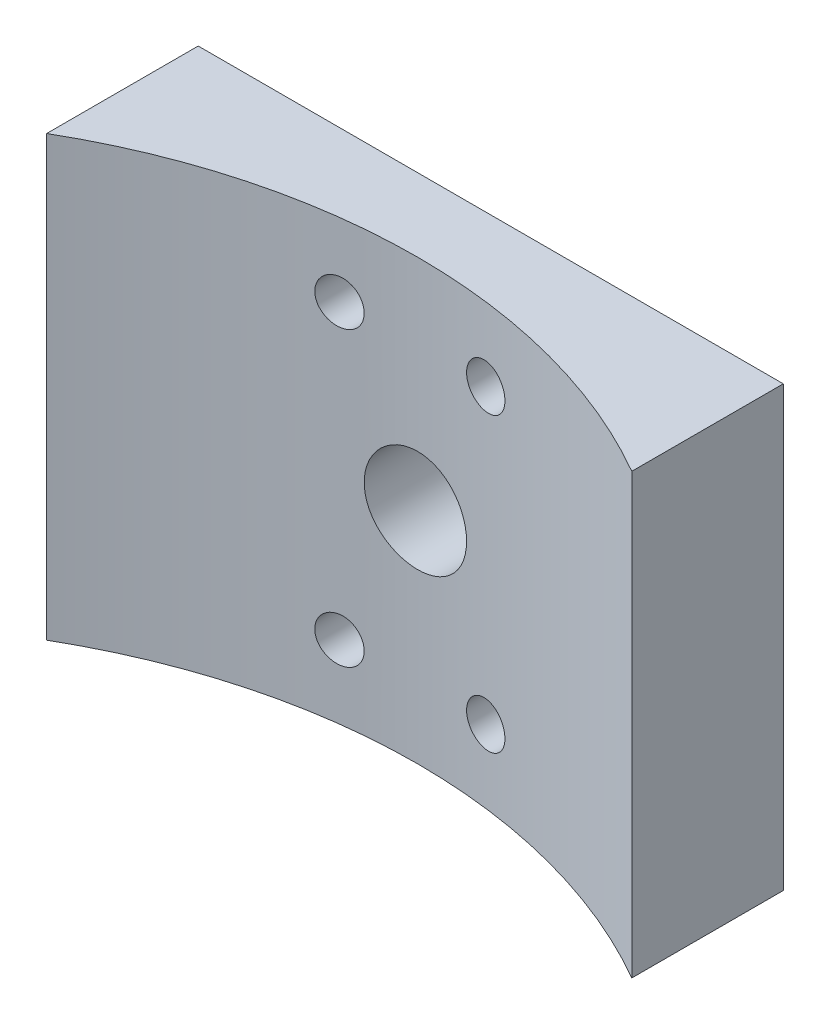
ISO-10303-21;
HEADER;
FILE_DESCRIPTION(('STEP AP214'),'2;1');
FILE_NAME('part.step','',(''),(''),'','','');
FILE_SCHEMA(('AUTOMOTIVE_DESIGN { 1 0 10303 214 1 1 1 1 }'));
ENDSEC;
DATA;
#1=APPLICATION_CONTEXT('core data for automotive mechanical design processes');
#2=APPLICATION_PROTOCOL_DEFINITION('international standard','automotive_design',2000,#1);
#3=PRODUCT_CONTEXT('',#1,'mechanical');
#4=PRODUCT('Part','Part','',(#3));
#5=PRODUCT_RELATED_PRODUCT_CATEGORY('part','',(#4));
#6=PRODUCT_DEFINITION_FORMATION('','',#4);
#7=PRODUCT_DEFINITION_CONTEXT('part definition',#1,'design');
#8=PRODUCT_DEFINITION('design','',#6,#7);
#9=PRODUCT_DEFINITION_SHAPE('','',#8);
#10=(LENGTH_UNIT() NAMED_UNIT(*) SI_UNIT(.MILLI.,.METRE.));
#11=(NAMED_UNIT(*) PLANE_ANGLE_UNIT() SI_UNIT($,.RADIAN.));
#12=(NAMED_UNIT(*) SI_UNIT($,.STERADIAN.) SOLID_ANGLE_UNIT());
#13=UNCERTAINTY_MEASURE_WITH_UNIT(LENGTH_MEASURE(1.E-05),#10,'distance_accuracy_value','');
#14=(GEOMETRIC_REPRESENTATION_CONTEXT(3) GLOBAL_UNCERTAINTY_ASSIGNED_CONTEXT((#13)) GLOBAL_UNIT_ASSIGNED_CONTEXT((#10,
#11,#12)) REPRESENTATION_CONTEXT('',''));
#15=CARTESIAN_POINT('',(0.,0.,0.));
#16=DIRECTION('',(0.,0.,1.));
#17=DIRECTION('',(1.,0.,0.));
#18=AXIS2_PLACEMENT_3D('',#15,#16,#17);
#19=CARTESIAN_POINT('',(20.,30.,-45.));
#20=DIRECTION('',(0.,0.,1.));
#21=DIRECTION('',(1.,0.,0.));
#22=AXIS2_PLACEMENT_3D('',#19,#20,#21);
#23=PLANE('',#22);
#24=CARTESIAN_POINT('',(-5.,25.,-45.));
#25=DIRECTION('',(0.,0.,1.));
#26=DIRECTION('',(1.,0.,0.));
#27=AXIS2_PLACEMENT_3D('',#24,#25,#26);
#28=CIRCLE('',#27,1.5);
#29=CARTESIAN_POINT('',(-3.5,25.,-45.));
#30=VERTEX_POINT('',#29);
#31=EDGE_CURVE('E163',#30,#30,#28,.T.);
#32=ORIENTED_EDGE('',*,*,#31,.T.);
#33=EDGE_LOOP('',(#32));
#34=FACE_BOUND('',#33,.T.);
#35=CARTESIAN_POINT('',(5.,25.,-45.));
#36=DIRECTION('',(0.,0.,1.));
#37=DIRECTION('',(1.,0.,0.));
#38=AXIS2_PLACEMENT_3D('',#35,#36,#37);
#39=CIRCLE('',#38,1.5);
#40=CARTESIAN_POINT('',(6.5,25.,-45.));
#41=VERTEX_POINT('',#40);
#42=EDGE_CURVE('E167',#41,#41,#39,.T.);
#43=ORIENTED_EDGE('',*,*,#42,.T.);
#44=EDGE_LOOP('',(#43));
#45=FACE_BOUND('',#44,.T.);
#46=CARTESIAN_POINT('',(0.,15.,-45.));
#47=DIRECTION('',(0.,0.,1.));
#48=DIRECTION('',(1.,0.,0.));
#49=AXIS2_PLACEMENT_3D('',#46,#47,#48);
#50=CIRCLE('',#49,3.5);
#51=CARTESIAN_POINT('',(3.5,15.,-45.));
#52=VERTEX_POINT('',#51);
#53=EDGE_CURVE('E171',#52,#52,#50,.T.);
#54=ORIENTED_EDGE('',*,*,#53,.T.);
#55=EDGE_LOOP('',(#54));
#56=FACE_BOUND('',#55,.T.);
#57=CARTESIAN_POINT('',(5.,5.,-45.));
#58=DIRECTION('',(0.,0.,1.));
#59=DIRECTION('',(1.,0.,0.));
#60=AXIS2_PLACEMENT_3D('',#57,#58,#59);
#61=CIRCLE('',#60,1.5);
#62=CARTESIAN_POINT('',(6.5,5.,-45.));
#63=VERTEX_POINT('',#62);
#64=EDGE_CURVE('E175',#63,#63,#61,.T.);
#65=ORIENTED_EDGE('',*,*,#64,.T.);
#66=EDGE_LOOP('',(#65));
#67=FACE_BOUND('',#66,.T.);
#68=CARTESIAN_POINT('',(-5.,5.,-45.));
#69=DIRECTION('',(0.,0.,1.));
#70=DIRECTION('',(1.,0.,0.));
#71=AXIS2_PLACEMENT_3D('',#68,#69,#70);
#72=CIRCLE('',#71,1.5);
#73=CARTESIAN_POINT('',(-3.5,5.,-45.));
#74=VERTEX_POINT('',#73);
#75=EDGE_CURVE('E126',#74,#74,#72,.T.);
#76=ORIENTED_EDGE('',*,*,#75,.T.);
#77=EDGE_LOOP('',(#76));
#78=FACE_BOUND('',#77,.T.);
#79=DIRECTION('',(-1.,0.,0.));
#80=VECTOR('',#79,1.);
#81=CARTESIAN_POINT('',(20.,0.,-45.));
#82=LINE('',#81,#80);
#83=CARTESIAN_POINT('',(20.,0.,-45.));
#84=VERTEX_POINT('',#83);
#85=CARTESIAN_POINT('',(-20.,0.,-45.));
#86=VERTEX_POINT('',#85);
#87=EDGE_CURVE('E100',#84,#86,#82,.T.);
#88=ORIENTED_EDGE('',*,*,#87,.T.);
#89=DIRECTION('',(0.,-1.,0.));
#90=VECTOR('',#89,1.);
#91=CARTESIAN_POINT('',(-20.,30.,-45.));
#92=LINE('',#91,#90);
#93=CARTESIAN_POINT('',(-20.,30.,-45.));
#94=VERTEX_POINT('',#93);
#95=EDGE_CURVE('E53',#94,#86,#92,.T.);
#96=ORIENTED_EDGE('',*,*,#95,.F.);
#97=DIRECTION('',(-1.,0.,0.));
#98=VECTOR('',#97,1.);
#99=CARTESIAN_POINT('',(20.,30.,-45.));
#100=LINE('',#99,#98);
#101=CARTESIAN_POINT('',(20.,30.,-45.));
#102=VERTEX_POINT('',#101);
#103=EDGE_CURVE('E93',#102,#94,#100,.T.);
#104=ORIENTED_EDGE('',*,*,#103,.F.);
#105=DIRECTION('',(0.,-1.,0.));
#106=VECTOR('',#105,1.);
#107=CARTESIAN_POINT('',(20.,30.,-45.));
#108=LINE('',#107,#106);
#109=EDGE_CURVE('E11',#102,#84,#108,.T.);
#110=ORIENTED_EDGE('',*,*,#109,.T.);
#111=EDGE_LOOP('',(#88,#96,#104,#110));
#112=FACE_BOUND('',#111,.T.);
#113=ADVANCED_FACE('F39',(#34,#45,#56,#67,#78,#112),#23,.F.);
#114=CARTESIAN_POINT('',(-20.,30.,-34.6410161513775));
#115=DIRECTION('',(1.,0.,0.));
#116=DIRECTION('',(0.,0.,-1.));
#117=AXIS2_PLACEMENT_3D('',#114,#115,#116);
#118=PLANE('',#117);
#119=DIRECTION('',(0.,0.,1.));
#120=VECTOR('',#119,1.);
#121=CARTESIAN_POINT('',(-20.,0.,-34.6410161513775));
#122=LINE('',#121,#120);
#123=CARTESIAN_POINT('',(-20.,0.,-34.6410161513776));
#124=VERTEX_POINT('',#123);
#125=EDGE_CURVE('E80',#86,#124,#122,.T.);
#126=ORIENTED_EDGE('',*,*,#125,.T.);
#127=DIRECTION('',(0.,-1.,0.));
#128=VECTOR('',#127,1.);
#129=CARTESIAN_POINT('',(-20.,30.,-34.6410161513776));
#130=LINE('',#129,#128);
#131=CARTESIAN_POINT('',(-20.,30.,-34.6410161513776));
#132=VERTEX_POINT('',#131);
#133=EDGE_CURVE('E101',#132,#124,#130,.T.);
#134=ORIENTED_EDGE('',*,*,#133,.F.);
#135=DIRECTION('',(0.,0.,1.));
#136=VECTOR('',#135,1.);
#137=CARTESIAN_POINT('',(-20.,30.,-34.6410161513775));
#138=LINE('',#137,#136);
#139=EDGE_CURVE('E97',#94,#132,#138,.T.);
#140=ORIENTED_EDGE('',*,*,#139,.F.);
#141=ORIENTED_EDGE('',*,*,#95,.T.);
#142=EDGE_LOOP('',(#126,#134,#140,#141));
#143=FACE_BOUND('',#142,.T.);
#144=ADVANCED_FACE('F103',(#143),#118,.F.);
#145=CARTESIAN_POINT('',(0.,30.,0.));
#146=DIRECTION('',(0.,-1.,0.));
#147=DIRECTION('',(0.,0.,-1.));
#148=AXIS2_PLACEMENT_3D('',#145,#146,#147);
#149=CYLINDRICAL_SURFACE('',#148,40.);
#150=CARTESIAN_POINT('',(-3.5,25.,-39.8465807817936));
#151=CARTESIAN_POINT('',(-3.50000373797588,24.9160128912899,-39.8465806922854));
#152=CARTESIAN_POINT('',(-3.50707785950746,24.8319655550053,-39.8459610473165));
#153=CARTESIAN_POINT('',(-3.53519471900338,24.6661893212649,-39.8434761258713));
#154=CARTESIAN_POINT('',(-3.55625406423366,24.5844633008014,-39.8416093684499));
#155=CARTESIAN_POINT('',(-3.61172603582646,24.4257572835559,-39.836618908098));
#156=CARTESIAN_POINT('',(-3.64613164881106,24.3487748186474,-39.8334958653055));
#157=CARTESIAN_POINT('',(-3.72728881725058,24.2017149358876,-39.8259836122539));
#158=CARTESIAN_POINT('',(-3.77403735714886,24.131635837178,-39.8215947112383));
#159=CARTESIAN_POINT('',(-3.87859945003601,24.0002404913503,-39.8115463161016));
#160=CARTESIAN_POINT('',(-3.9364273482634,23.9389357868464,-39.8058851730558));
#161=CARTESIAN_POINT('',(-4.06144091051803,23.8269047535652,-39.7933240147348));
#162=CARTESIAN_POINT('',(-4.12862705661754,23.7761789700772,-39.786423935633));
#163=CARTESIAN_POINT('',(-4.27068834096132,23.6865372664833,-39.7714260910097));
#164=CARTESIAN_POINT('',(-4.34559063326757,23.6476651016565,-39.763324048357));
#165=CARTESIAN_POINT('',(-4.50073796582216,23.5830313218533,-39.7460620033414));
#166=CARTESIAN_POINT('',(-4.58098315389696,23.5572700697985,-39.7369019717011));
#167=CARTESIAN_POINT('',(-4.74502770909669,23.5194203534495,-39.7176480651879));
#168=CARTESIAN_POINT('',(-4.82884509376628,23.5074126058888,-39.7075490497269));
#169=CARTESIAN_POINT('',(-4.99722717898924,23.4976334469261,-39.6867095820572));
#170=CARTESIAN_POINT('',(-5.08179190797715,23.4998625795499,-39.6759691053522));
#171=CARTESIAN_POINT('',(-5.24984087644487,23.5185237667003,-39.6540842433544));
#172=CARTESIAN_POINT('',(-5.33331482639723,23.5350460419507,-39.6429377240222));
#173=CARTESIAN_POINT('',(-5.49628310364188,23.5819403828983,-39.6206718876695));
#174=CARTESIAN_POINT('',(-5.57577730947913,23.612312870995,-39.6095525714889));
#175=CARTESIAN_POINT('',(-5.72878028594351,23.6861820772333,-39.5877136544592));
#176=CARTESIAN_POINT('',(-5.80227015984354,23.7297183450289,-39.5769953690742));
#177=CARTESIAN_POINT('',(-5.94088984979049,23.828685213947,-39.5564248337142));
#178=CARTESIAN_POINT('',(-6.00601976173672,23.8841156786083,-39.5465725738053));
#179=CARTESIAN_POINT('',(-6.12577304855632,24.0050883729235,-39.5281996560071));
#180=CARTESIAN_POINT('',(-6.18043823311154,24.0705883950629,-39.5196737257758));
#181=CARTESIAN_POINT('',(-6.27796261780314,24.2100322819332,-39.5042988916827));
#182=CARTESIAN_POINT('',(-6.3208225311569,24.2839756361767,-39.4974498865119));
#183=CARTESIAN_POINT('',(-6.393034627049,24.4373609369451,-39.4858257873177));
#184=CARTESIAN_POINT('',(-6.42252723712618,24.5167351313949,-39.4810291638424));
#185=CARTESIAN_POINT('',(-6.46776862359136,24.6794055290999,-39.4736431021857));
#186=CARTESIAN_POINT('',(-6.48351839487047,24.7627014479878,-39.4710535042304));
#187=CARTESIAN_POINT('',(-6.50068696427149,24.9298587379863,-39.4682295630638));
#188=CARTESIAN_POINT('',(-6.50226295803732,25.0137035589137,-39.4679693853387));
#189=CARTESIAN_POINT('',(-6.49144716674239,25.1804605181451,-39.4697497178083));
#190=CARTESIAN_POINT('',(-6.47905581722962,25.263372685451,-39.4717901562623));
#191=CARTESIAN_POINT('',(-6.44075641658869,25.4256096107729,-39.478057543909));
#192=CARTESIAN_POINT('',(-6.41489692316825,25.5049461510818,-39.4822766377695));
#193=CARTESIAN_POINT('',(-6.35046722044509,25.6581364570129,-39.4926907777995));
#194=CARTESIAN_POINT('',(-6.31189666546832,25.7319900734616,-39.4988858777058));
#195=CARTESIAN_POINT('',(-6.22288553103596,25.8726530359879,-39.5130071212095));
#196=CARTESIAN_POINT('',(-6.17236929152719,25.9394133792804,-39.5209442743746));
#197=CARTESIAN_POINT('',(-6.06106175223112,26.0635308967601,-39.5381675654477));
#198=CARTESIAN_POINT('',(-6.00026980782533,26.1208874805831,-39.5474537879806));
#199=CARTESIAN_POINT('',(-5.86934719745248,26.2252866834049,-39.5670972917718));
#200=CARTESIAN_POINT('',(-5.79911474625411,26.2721995330642,-39.5774659242203));
#201=CARTESIAN_POINT('',(-5.65185117167274,26.3535761437824,-39.5987639654865));
#202=CARTESIAN_POINT('',(-5.57481967741676,26.3880392252108,-39.6096934048815));
#203=CARTESIAN_POINT('',(-5.41535743474732,26.4438417540913,-39.6318109187807));
#204=CARTESIAN_POINT('',(-5.33288327082882,26.4650566395331,-39.6430004514075));
#205=CARTESIAN_POINT('',(-5.16550629511387,26.4932550141931,-39.6651568624646));
#206=CARTESIAN_POINT('',(-5.08060343511237,26.5002382207402,-39.6761237364682));
#207=CARTESIAN_POINT('',(-4.91059789395773,26.4997488809191,-39.6975236285638));
#208=CARTESIAN_POINT('',(-4.82549515087341,26.4922475936575,-39.7079555429941));
#209=CARTESIAN_POINT('',(-4.65769727853012,26.4629021377426,-39.7279875894891));
#210=CARTESIAN_POINT('',(-4.57500210713367,26.4410582202729,-39.7375877361172));
#211=CARTESIAN_POINT('',(-4.41476566130469,26.3837304399044,-39.7557080537848));
#212=CARTESIAN_POINT('',(-4.33720358516265,26.3483061590334,-39.7642327291638));
#213=CARTESIAN_POINT('',(-4.18910470270521,26.2647825761103,-39.7801075282266));
#214=CARTESIAN_POINT('',(-4.118567385965,26.2166841958959,-39.7874577372715));
#215=CARTESIAN_POINT('',(-3.98702831148604,26.109521437348,-39.8008537064444));
#216=CARTESIAN_POINT('',(-3.92596635148437,26.0505319886348,-39.8069078034998));
#217=CARTESIAN_POINT('',(-3.81459193777502,25.9230239784924,-39.8177350991572));
#218=CARTESIAN_POINT('',(-3.76428182643249,25.8545033459851,-39.8225080187036));
#219=CARTESIAN_POINT('',(-3.67612592458433,25.7102610617651,-39.8307425896632));
#220=CARTESIAN_POINT('',(-3.63822104990794,25.6345758257105,-39.8342104689829));
#221=CARTESIAN_POINT('',(-3.57568487577341,25.4779347759603,-39.8398729040452));
#222=CARTESIAN_POINT('',(-3.55103752516617,25.3969854693496,-39.8420689998097));
#223=CARTESIAN_POINT('',(-3.52227719080437,25.2629333245016,-39.8446191843353));
#224=CARTESIAN_POINT('',(-3.51393398429278,25.2107071375291,-39.845354807283));
#225=CARTESIAN_POINT('',(-3.50279421726449,25.1056619137645,-39.8463356337902));
#226=CARTESIAN_POINT('',(-3.49999764814617,25.0528428778919,-39.8465808381102));
#227=CARTESIAN_POINT('',(-3.5,25.,-39.8465807817936));
#228=B_SPLINE_CURVE_WITH_KNOTS('',3,(#150,#151,#152,#153,#154,#155,#156,#157,#158,#159,#160,
#161,#162,#163,#164,#165,#166,#167,#168,#169,#170,#171,#172,#173,#174,#175,#176,#177,#178,#179,
#180,#181,#182,#183,#184,#185,#186,#187,#188,#189,#190,#191,#192,#193,#194,#195,#196,#197,#198,
#199,#200,#201,#202,#203,#204,#205,#206,#207,#208,#209,#210,#211,#212,#213,#214,#215,#216,#217,
#218,#219,#220,#221,#222,#223,#224,#225,#226,#227),.UNSPECIFIED.,.T.,.F.,(4,2,2,2,2,2,2,2,2,2,2,
2,2,2,2,2,2,2,2,2,2,2,2,2,2,2,2,2,2,2,2,2,2,2,2,2,2,2,4),(0.,0.251768269484007,
0.503836046304622,0.755771542178798,1.00764554340982,1.25984789519965,1.51206324352029,
1.76519862877591,2.01834102065754,2.27296156574135,2.52759184055352,2.78384121016841,
3.04009839531853,3.29713326921157,3.55416519432619,3.81014772857969,4.06611479421306,
4.31932670698297,4.57252028735529,4.82290228947461,5.07327648407039,5.32275417152299,
5.57223864401702,5.8233477173083,6.07447254909683,6.32856233748357,6.58266599449072,
6.8391241660213,7.09558743130066,7.35256010743832,7.60952828331458,7.865381714886,
8.12121654235141,8.37535274220293,8.6295442510844,8.88250684396863,9.13516247665609,
9.29356988890848,9.45197705550509),.UNSPECIFIED.);
#229=CARTESIAN_POINT('',(-3.5,25.,-39.8465807817936));
#230=VERTEX_POINT('',#229);
#231=EDGE_CURVE('E42',#230,#230,#228,.T.);
#232=ORIENTED_EDGE('',*,*,#231,.T.);
#233=EDGE_LOOP('',(#232));
#234=FACE_BOUND('',#233,.T.);
#235=CARTESIAN_POINT('',(6.5,25.,-39.4683417437318));
#236=CARTESIAN_POINT('',(6.49999617130281,24.9165214070182,-39.4683426140771));
#237=CARTESIAN_POINT('',(6.49300639215417,24.8329825163112,-39.4694954855834));
#238=CARTESIAN_POINT('',(6.46523716954101,24.6682238806092,-39.474053483629));
#239=CARTESIAN_POINT('',(6.4444412525342,24.5870070271805,-39.4774613007631));
#240=CARTESIAN_POINT('',(6.38970537902534,24.4293198158184,-39.4863575040994));
#241=CARTESIAN_POINT('',(6.35577592598174,24.352845721455,-39.4918442276362));
#242=CARTESIAN_POINT('',(6.27579266145439,24.2067214376418,-39.5046333838692));
#243=CARTESIAN_POINT('',(6.2297413962462,24.137069819292,-39.5119354352246));
#244=CARTESIAN_POINT('',(6.12649932809729,24.006016085929,-39.5280754148235));
#245=CARTESIAN_POINT('',(6.06923576899893,23.9446725337833,-39.5369233314131));
#246=CARTESIAN_POINT('',(5.94540141993021,23.8324381308592,-39.5557343127879));
#247=CARTESIAN_POINT('',(5.8788297278949,23.7815482943476,-39.5656974856354));
#248=CARTESIAN_POINT('',(5.73740267909242,23.691043197936,-39.5864543813716));
#249=CARTESIAN_POINT('',(5.66245873296921,23.6515682713178,-39.5972565273725));
#250=CARTESIAN_POINT('',(5.50704332781782,23.5857763158798,-39.6191699491778));
#251=CARTESIAN_POINT('',(5.42657161681487,23.5594598873236,-39.6302812390604));
#252=CARTESIAN_POINT('',(5.26174263759211,23.5205702750879,-39.6525033909548));
#253=CARTESIAN_POINT('',(5.17736141628661,23.5080981786117,-39.663613665079));
#254=CARTESIAN_POINT('',(5.00764833398393,23.4976120237386,-39.6853975221244));
#255=CARTESIAN_POINT('',(4.9223164703464,23.4995980055079,-39.6960711038324));
#256=CARTESIAN_POINT('',(4.75315843402744,23.5180064031606,-39.7166809286628));
#257=CARTESIAN_POINT('',(4.66933180172637,23.5344243330652,-39.7266173998655));
#258=CARTESIAN_POINT('',(4.50557336745914,23.5812701144323,-39.7455230968967));
#259=CARTESIAN_POINT('',(4.42564146629205,23.611697608857,-39.754492347368));
#260=CARTESIAN_POINT('',(4.27242809165914,23.6855302322058,-39.7712493094325));
#261=CARTESIAN_POINT('',(4.19911240624519,23.7288629425067,-39.7790432580278));
#262=CARTESIAN_POINT('',(4.06078047106754,23.8273639089335,-39.79340278744));
#263=CARTESIAN_POINT('',(3.99576393571626,23.8825317576174,-39.7999684105293));
#264=CARTESIAN_POINT('',(3.87632994973782,24.0027541104426,-39.8117778200908));
#265=CARTESIAN_POINT('',(3.82184722203225,24.0677429653205,-39.8170298108251));
#266=CARTESIAN_POINT('',(3.72456025645511,24.2060230591118,-39.8262482117185));
#267=CARTESIAN_POINT('',(3.68175571899357,24.2793140849746,-39.8302146548573));
#268=CARTESIAN_POINT('',(3.60925040721795,24.431751339122,-39.8368502442174));
#269=CARTESIAN_POINT('',(3.5794900797946,24.510868989354,-39.8395252920833));
#270=CARTESIAN_POINT('',(3.5336538947166,24.6730046184078,-39.8436171083531));
#271=CARTESIAN_POINT('',(3.51757783571846,24.756022539824,-39.8450338952705));
#272=CARTESIAN_POINT('',(3.49960046135232,24.9233924840297,-39.8466169142071));
#273=CARTESIAN_POINT('',(3.49766587190865,25.0077409068285,-39.8467860818123));
#274=CARTESIAN_POINT('',(3.50793953616071,25.1755649245519,-39.8458829215376));
#275=CARTESIAN_POINT('',(3.52014769988645,25.2590405250255,-39.8448106015555));
#276=CARTESIAN_POINT('',(3.55834115905715,25.4227018418673,-39.8414177912999));
#277=CARTESIAN_POINT('',(3.58431876151563,25.5028893683577,-39.8390979979792));
#278=CARTESIAN_POINT('',(3.64929231057518,25.6577536859623,-39.8331987611027));
#279=CARTESIAN_POINT('',(3.68828825776801,25.732430476826,-39.8296193174896));
#280=CARTESIAN_POINT('',(3.7782149603459,25.8742412579998,-39.8211894020704));
#281=CARTESIAN_POINT('',(3.82915788680741,25.9413674522001,-39.8163376334737));
#282=CARTESIAN_POINT('',(3.9414826444148,26.0661076681879,-39.8053751447666));
#283=CARTESIAN_POINT('',(4.00286458025831,26.1237215945611,-39.7992644120293));
#284=CARTESIAN_POINT('',(4.13449552883889,26.2279953734172,-39.785805610197));
#285=CARTESIAN_POINT('',(4.2047701531654,26.2746224260794,-39.778453945849));
#286=CARTESIAN_POINT('',(4.35202652529865,26.3554277963947,-39.7626123696437));
#287=CARTESIAN_POINT('',(4.42900842888368,26.3896058248205,-39.7541224313473));
#288=CARTESIAN_POINT('',(4.58790758047252,26.4447452573949,-39.7360985130785));
#289=CARTESIAN_POINT('',(4.66984846956498,26.4656368175668,-39.7265593200433));
#290=CARTESIAN_POINT('',(4.83597841643334,26.4933820964426,-39.7066784033025));
#291=CARTESIAN_POINT('',(4.92016756436389,26.5002352513511,-39.6963366473825));
#292=CARTESIAN_POINT('',(5.08898660255816,26.4997508318074,-39.6750488335213));
#293=CARTESIAN_POINT('',(5.1736157885781,26.4923204648706,-39.6640992758996));
#294=CARTESIAN_POINT('',(5.34038834875135,26.4633181711703,-39.6419895004404));
#295=CARTESIAN_POINT('',(5.42253162975845,26.4417457151911,-39.6308292747346));
#296=CARTESIAN_POINT('',(5.58240070190373,26.3849327522614,-39.6086272135286));
#297=CARTESIAN_POINT('',(5.66010440627269,26.3496297554253,-39.5975861599775));
#298=CARTESIAN_POINT('',(5.80847397346898,26.2663361355179,-39.5760945044363));
#299=CARTESIAN_POINT('',(5.87914007093402,26.2183459356401,-39.5656438827659));
#300=CARTESIAN_POINT('',(6.01129234054462,26.1110886132308,-39.5457814428627));
#301=CARTESIAN_POINT('',(6.0727937691611,26.0518406144128,-39.5363679051597));
#302=CARTESIAN_POINT('',(6.18496600104989,25.9236392815812,-39.5189755285406));
#303=CARTESIAN_POINT('',(6.23563461082055,25.8546839866484,-39.5109969802426));
#304=CARTESIAN_POINT('',(6.32420958104359,25.7096683359898,-39.4969160026109));
#305=CARTESIAN_POINT('',(6.36222181701817,25.6336740914343,-39.4907980481056));
#306=CARTESIAN_POINT('',(6.42488150455098,25.4763056878613,-39.4806524177874));
#307=CARTESIAN_POINT('',(6.44954619446168,25.3949386210512,-39.4766220461517));
#308=CARTESIAN_POINT('',(6.47807627626808,25.2608513230156,-39.4719475121391));
#309=CARTESIAN_POINT('',(6.48628655080901,25.2090396983087,-39.4705981466405));
#310=CARTESIAN_POINT('',(6.49724959308581,25.1048266396059,-39.4687949927249));
#311=CARTESIAN_POINT('',(6.50000240445183,25.0524252103286,-39.4683411971481));
#312=CARTESIAN_POINT('',(6.5,25.,-39.4683417437318));
#313=B_SPLINE_CURVE_WITH_KNOTS('',3,(#235,#236,#237,#238,#239,#240,#241,#242,#243,#244,#245,
#246,#247,#248,#249,#250,#251,#252,#253,#254,#255,#256,#257,#258,#259,#260,#261,#262,#263,#264,
#265,#266,#267,#268,#269,#270,#271,#272,#273,#274,#275,#276,#277,#278,#279,#280,#281,#282,#283,
#284,#285,#286,#287,#288,#289,#290,#291,#292,#293,#294,#295,#296,#297,#298,#299,#300,#301,#302,
#303,#304,#305,#306,#307,#308,#309,#310,#311,#312),.UNSPECIFIED.,.T.,.F.,(4,2,2,2,2,2,2,2,2,2,2,
2,2,2,2,2,2,2,2,2,2,2,2,2,2,2,2,2,2,2,2,2,2,2,2,2,2,2,4),(0.,0.250242984231054,
0.500785097402838,0.751127253782962,1.00141686586352,1.25338790231199,1.50538337459355,
1.76035658198961,2.01534141967444,2.27217607840909,2.52901145066155,2.78576701728315,
3.04251604077814,3.29785060712957,3.55317638462326,3.80686530553488,4.06054771774936,
4.31305956721941,4.5655677012922,4.81748150622841,5.06939370860845,5.32116531574297,
5.5729369343223,5.82496617001951,6.07699793358324,6.32977283195752,6.58255360265901,
6.83665243451688,7.09076147102309,7.34652689982948,7.60230190026328,7.85925485807005,
8.1161992460528,8.37271100073111,8.62927464653623,8.88363470099919,9.13766546073145,
9.2948212715275,9.45197582592258),.UNSPECIFIED.);
#314=CARTESIAN_POINT('',(6.5,25.,-39.4683417437318));
#315=VERTEX_POINT('',#314);
#316=EDGE_CURVE('E195',#315,#315,#313,.T.);
#317=ORIENTED_EDGE('',*,*,#316,.T.);
#318=EDGE_LOOP('',(#317));
#319=FACE_BOUND('',#318,.T.);
#320=CARTESIAN_POINT('',(3.5,15.,-39.8465807817936));
#321=CARTESIAN_POINT('',(3.49999144548065,14.8038076306384,-39.8465828091978));
#322=CARTESIAN_POINT('',(3.483448154376,14.6074825909658,-39.848045370637));
#323=CARTESIAN_POINT('',(3.4176988145616,14.2202671572285,-39.8537373598452));
#324=CARTESIAN_POINT('',(3.36845599242041,14.0293831343979,-39.8579699026186));
#325=CARTESIAN_POINT('',(3.23874494533817,13.6587137969815,-39.8687188270403));
#326=CARTESIAN_POINT('',(3.15829470883661,13.4789221576453,-39.8752338927977));
#327=CARTESIAN_POINT('',(2.96848513385315,13.135436284568,-39.8898121410542));
#328=CARTESIAN_POINT('',(2.85913187331911,12.9717386763694,-39.8978749979746));
#329=CARTESIAN_POINT('',(2.61428817223652,12.6645847506284,-39.9146658266153));
#330=CARTESIAN_POINT('',(2.47873309198289,12.5211800431389,-39.9233954102467));
#331=CARTESIAN_POINT('',(2.18547081865468,12.2591262991693,-39.9405213601566));
#332=CARTESIAN_POINT('',(2.02776264776273,12.1404783560052,-39.9489177117055));
#333=CARTESIAN_POINT('',(1.69436079423246,11.9311325562092,-39.9644466087716));
#334=CARTESIAN_POINT('',(1.51863878883184,11.8404796419022,-39.97157711442));
#335=CARTESIAN_POINT('',(1.15439470745122,11.6899846770912,-39.9837534892168));
#336=CARTESIAN_POINT('',(0.965872876046092,11.630142038062,-39.9887993981841));
#337=CARTESIAN_POINT('',(0.58189654568422,11.5431156879006,-39.9962267639801));
#338=CARTESIAN_POINT('',(0.386461189328907,11.5158481091684,-39.9986150619891));
#339=CARTESIAN_POINT('',(-0.00622581578570643,11.4944865869159,-40.00048131454));
#340=CARTESIAN_POINT('',(-0.203477427580262,11.500391969737,-39.9999593281823));
#341=CARTESIAN_POINT('',(-0.593628870603708,11.5451402698188,-39.9960694592647));
#342=CARTESIAN_POINT('',(-0.786539134147025,11.5838930015135,-39.9927093690809));
#343=CARTESIAN_POINT('',(-1.16310660926702,11.6930956586766,-39.9835301116565));
#344=CARTESIAN_POINT('',(-1.34676372516994,11.7635459118098,-39.9777109189955));
#345=CARTESIAN_POINT('',(-1.69989790472235,11.9342439214751,-39.9642546126829));
#346=CARTESIAN_POINT('',(-1.86935540156573,12.0345319558154,-39.9566150445127));
#347=CARTESIAN_POINT('',(-2.1890665183457,12.2620294743335,-39.9403762100968));
#348=CARTESIAN_POINT('',(-2.33931970809756,12.3892395614074,-39.931776922361));
#349=CARTESIAN_POINT('',(-2.61688459673902,12.6674781976517,-39.9145507289992));
#350=CARTESIAN_POINT('',(-2.74411773253031,12.8185851330038,-39.9059238273874));
#351=CARTESIAN_POINT('',(-2.97142357440567,13.1400552481662,-39.8896436410195));
#352=CARTESIAN_POINT('',(-3.07149625462266,13.3104184463156,-39.8819903571907));
#353=CARTESIAN_POINT('',(-3.24163810647108,13.6656214780195,-39.8685227104348));
#354=CARTESIAN_POINT('',(-3.31170302023216,13.8504633615892,-39.8627086085041));
#355=CARTESIAN_POINT('',(-3.41978135650429,14.2293496459934,-39.8535828139277));
#356=CARTESIAN_POINT('',(-3.45779552297569,14.4233938331142,-39.8502710631978));
#357=CARTESIAN_POINT('',(-3.50059345308565,14.8144885384048,-39.8465345365353));
#358=CARTESIAN_POINT('',(-3.50548685603159,15.0115269714325,-39.8461002355129));
#359=CARTESIAN_POINT('',(-3.48219172428613,15.4036212649625,-39.8481426439256));
#360=CARTESIAN_POINT('',(-3.4540035302992,15.598677145862,-39.8506193233807));
#361=CARTESIAN_POINT('',(-3.36543684319894,15.9809535341852,-39.8581959549085));
#362=CARTESIAN_POINT('',(-3.30510967350783,16.1681860222843,-39.8632917240446));
#363=CARTESIAN_POINT('',(-3.15402972829006,16.5298722032186,-39.8755289233432));
#364=CARTESIAN_POINT('',(-3.0632764155147,16.7043256703425,-39.8826703896271));
#365=CARTESIAN_POINT('',(-2.85364355220503,17.0360029727911,-39.8982174090971));
#366=CARTESIAN_POINT('',(-2.73469103541275,17.1931805355729,-39.9066262206652));
#367=CARTESIAN_POINT('',(-2.47214158373286,17.4853763013431,-39.923749540086));
#368=CARTESIAN_POINT('',(-2.32854418162126,17.6203940841258,-39.9324640537318));
#369=CARTESIAN_POINT('',(-2.02030694242064,17.8648127655354,-39.9492453285108));
#370=CARTESIAN_POINT('',(-1.85561045090269,17.9741423610453,-39.9573102467596));
#371=CARTESIAN_POINT('',(-1.51013187344782,18.1635916349912,-39.9718570116321));
#372=CARTESIAN_POINT('',(-1.32934996237841,18.2437116309218,-39.9783388754626));
#373=CARTESIAN_POINT('',(-0.957086237403814,18.3723453202784,-39.9889807598233));
#374=CARTESIAN_POINT('',(-0.765619672356692,18.4209028664738,-39.9931440006835));
#375=CARTESIAN_POINT('',(-0.377213164756263,18.4851765644692,-39.9986926647472));
#376=CARTESIAN_POINT('',(-0.180273337576422,18.5008934080025,-40.0000781464594));
#377=CARTESIAN_POINT('',(0.212787038994877,18.499031111851,-39.9999152489767));
#378=CARTESIAN_POINT('',(0.408908127981965,18.4815629927268,-39.998376652303));
#379=CARTESIAN_POINT('',(0.795419488403752,18.414058443548,-39.9925578027594));
#380=CARTESIAN_POINT('',(0.985809752733395,18.3640219731171,-39.9882775464905));
#381=CARTESIAN_POINT('',(1.35546024897929,18.2328299108568,-39.9774554569329));
#382=CARTESIAN_POINT('',(1.53472130267502,18.1516766198725,-39.9709137908613));
#383=CARTESIAN_POINT('',(1.8770931421579,17.9605670102534,-39.9563001116113));
#384=CARTESIAN_POINT('',(2.04020414549785,17.8506110796837,-39.9482281190517));
#385=CARTESIAN_POINT('',(2.34621428686655,17.6046005329049,-39.9314271997662));
#386=CARTESIAN_POINT('',(2.48904712405537,17.4684635834654,-39.9226962548576));
#387=CARTESIAN_POINT('',(2.74989605095885,17.1741083770454,-39.9055786509445));
#388=CARTESIAN_POINT('',(2.8679061356559,17.0158847923235,-39.8971920756425));
#389=CARTESIAN_POINT('',(3.07593701159276,16.6815100826822,-39.8816944096419));
#390=CARTESIAN_POINT('',(3.16590059037033,16.5053232728094,-39.8745859385002));
#391=CARTESIAN_POINT('',(3.31485117004144,16.1404009695002,-39.8624810786097));
#392=CARTESIAN_POINT('',(3.3738736278164,15.9516801201837,-39.8574822735825));
#393=CARTESIAN_POINT('',(3.44430708975739,15.6348800544647,-39.8514425308533));
#394=CARTESIAN_POINT('',(3.46516398839712,15.508835647448,-39.8496278116174));
#395=CARTESIAN_POINT('',(3.4930132051891,15.2552128736929,-39.8471962794243));
#396=CARTESIAN_POINT('',(3.50000556521083,15.1276345115881,-39.8465794628496));
#397=CARTESIAN_POINT('',(3.5,15.,-39.8465807817936));
#398=B_SPLINE_CURVE_WITH_KNOTS('',3,(#320,#321,#322,#323,#324,#325,#326,#327,#328,#329,#330,
#331,#332,#333,#334,#335,#336,#337,#338,#339,#340,#341,#342,#343,#344,#345,#346,#347,#348,#349,
#350,#351,#352,#353,#354,#355,#356,#357,#358,#359,#360,#361,#362,#363,#364,#365,#366,#367,#368,
#369,#370,#371,#372,#373,#374,#375,#376,#377,#378,#379,#380,#381,#382,#383,#384,#385,#386,#387,
#388,#389,#390,#391,#392,#393,#394,#395,#396,#397),.UNSPECIFIED.,.T.,.F.,(4,2,2,2,2,2,2,2,2,2,2,
2,2,2,2,2,2,2,2,2,2,2,2,2,2,2,2,2,2,2,2,2,2,2,2,2,2,2,4),(0.,0.588111071995445,1.17688464802145,
1.76531934888771,2.35363040754075,2.94341178894665,3.53321921095353,4.12396862695151,
4.71470675827924,5.30392067744263,5.89312263121223,6.48071209478253,7.06830763254131,
7.65669998821209,8.2451055218155,8.83548277629813,9.4258605930425,10.0163221521094,
10.6067700050348,11.1952623447368,11.783748623661,12.3712979408373,12.9588576331943,
13.5479545747795,14.1370626858477,14.7277871702286,15.3185052335208,15.9084007906091,
16.4982839224291,17.086197070165,17.6741109467635,18.2619813601186,18.849843853358,
19.4395861960251,20.0294710430546,20.6205514476906,21.2109530166834,21.5935545233698,
21.976154874637),.UNSPECIFIED.);
#399=CARTESIAN_POINT('',(3.5,15.,-39.8465807817936));
#400=VERTEX_POINT('',#399);
#401=EDGE_CURVE('E193',#400,#400,#398,.T.);
#402=ORIENTED_EDGE('',*,*,#401,.T.);
#403=EDGE_LOOP('',(#402));
#404=FACE_BOUND('',#403,.T.);
#405=CARTESIAN_POINT('',(6.5,5.,-39.4683417437318));
#406=CARTESIAN_POINT('',(6.49999617130281,4.91652140701825,-39.4683426140771));
#407=CARTESIAN_POINT('',(6.49300639215417,4.83298251631117,-39.4694954855834));
#408=CARTESIAN_POINT('',(6.46523716954101,4.66822388060916,-39.474053483629));
#409=CARTESIAN_POINT('',(6.4444412525342,4.58700702718052,-39.4774613007631));
#410=CARTESIAN_POINT('',(6.38970537902534,4.42931981581838,-39.4863575040994));
#411=CARTESIAN_POINT('',(6.35577592598174,4.35284572145501,-39.4918442276362));
#412=CARTESIAN_POINT('',(6.27579266145439,4.20672143764182,-39.5046333838692));
#413=CARTESIAN_POINT('',(6.2297413962462,4.13706981929199,-39.5119354352246));
#414=CARTESIAN_POINT('',(6.12649932809729,4.00601608592904,-39.5280754148235));
#415=CARTESIAN_POINT('',(6.06923576899893,3.94467253378331,-39.5369233314131));
#416=CARTESIAN_POINT('',(5.94540141993021,3.83243813085923,-39.5557343127879));
#417=CARTESIAN_POINT('',(5.8788297278949,3.78154829434759,-39.5656974856354));
#418=CARTESIAN_POINT('',(5.73740267909242,3.69104319793604,-39.5864543813716));
#419=CARTESIAN_POINT('',(5.66245873296921,3.65156827131779,-39.5972565273725));
#420=CARTESIAN_POINT('',(5.50704332781782,3.58577631587985,-39.6191699491778));
#421=CARTESIAN_POINT('',(5.42657161681487,3.55945988732358,-39.6302812390604));
#422=CARTESIAN_POINT('',(5.26174263759211,3.52057027508793,-39.6525033909548));
#423=CARTESIAN_POINT('',(5.17736141628661,3.50809817861171,-39.663613665079));
#424=CARTESIAN_POINT('',(5.00764833398393,3.49761202373857,-39.6853975221244));
#425=CARTESIAN_POINT('',(4.9223164703464,3.49959800550794,-39.6960711038324));
#426=CARTESIAN_POINT('',(4.75315843402744,3.51800640316057,-39.7166809286628));
#427=CARTESIAN_POINT('',(4.66933180172637,3.53442433306525,-39.7266173998655));
#428=CARTESIAN_POINT('',(4.50557336745914,3.58127011443234,-39.7455230968967));
#429=CARTESIAN_POINT('',(4.42564146629205,3.61169760885701,-39.754492347368));
#430=CARTESIAN_POINT('',(4.27242809165914,3.68553023220576,-39.7712493094325));
#431=CARTESIAN_POINT('',(4.19911240624519,3.72886294250666,-39.7790432580278));
#432=CARTESIAN_POINT('',(4.06078047106754,3.82736390893351,-39.79340278744));
#433=CARTESIAN_POINT('',(3.99576393571625,3.88253175761742,-39.7999684105293));
#434=CARTESIAN_POINT('',(3.87632994973781,4.00275411044256,-39.8117778200908));
#435=CARTESIAN_POINT('',(3.82184722203225,4.06774296532054,-39.8170298108251));
#436=CARTESIAN_POINT('',(3.72456025645511,4.20602305911182,-39.8262482117185));
#437=CARTESIAN_POINT('',(3.68175571899357,4.2793140849746,-39.8302146548573));
#438=CARTESIAN_POINT('',(3.60925040721794,4.43175133912195,-39.8368502442174));
#439=CARTESIAN_POINT('',(3.5794900797946,4.51086898935398,-39.8395252920833));
#440=CARTESIAN_POINT('',(3.5336538947166,4.67300461840779,-39.8436171083531));
#441=CARTESIAN_POINT('',(3.51757783571846,4.75602253982399,-39.8450338952705));
#442=CARTESIAN_POINT('',(3.49960046135232,4.92339248402974,-39.8466169142071));
#443=CARTESIAN_POINT('',(3.49766587190865,5.00774090682854,-39.8467860818123));
#444=CARTESIAN_POINT('',(3.50793953616071,5.17556492455187,-39.8458829215376));
#445=CARTESIAN_POINT('',(3.52014769988645,5.2590405250255,-39.8448106015555));
#446=CARTESIAN_POINT('',(3.55834115905715,5.42270184186725,-39.8414177912999));
#447=CARTESIAN_POINT('',(3.58431876151563,5.50288936835773,-39.8390979979792));
#448=CARTESIAN_POINT('',(3.64929231057517,5.65775368596234,-39.8331987611027));
#449=CARTESIAN_POINT('',(3.68828825776801,5.73243047682598,-39.8296193174896));
#450=CARTESIAN_POINT('',(3.77821496034589,5.87424125799981,-39.8211894020704));
#451=CARTESIAN_POINT('',(3.82915788680741,5.94136745220007,-39.8163376334737));
#452=CARTESIAN_POINT('',(3.9414826444148,6.06610766818787,-39.8053751447666));
#453=CARTESIAN_POINT('',(4.00286458025831,6.12372159456107,-39.7992644120293));
#454=CARTESIAN_POINT('',(4.13449552883889,6.22799537341717,-39.785805610197));
#455=CARTESIAN_POINT('',(4.20477015316539,6.27462242607939,-39.778453945849));
#456=CARTESIAN_POINT('',(4.35202652529865,6.35542779639471,-39.7626123696438));
#457=CARTESIAN_POINT('',(4.42900842888367,6.3896058248205,-39.7541224313473));
#458=CARTESIAN_POINT('',(4.58790758047252,6.44474525739486,-39.7360985130785));
#459=CARTESIAN_POINT('',(4.66984846956498,6.46563681756675,-39.7265593200433));
#460=CARTESIAN_POINT('',(4.83597841643334,6.49338209644263,-39.7066784033025));
#461=CARTESIAN_POINT('',(4.92016756436389,6.50023525135105,-39.6963366473825));
#462=CARTESIAN_POINT('',(5.08898660255816,6.4997508318074,-39.6750488335213));
#463=CARTESIAN_POINT('',(5.1736157885781,6.49232046487055,-39.6640992758996));
#464=CARTESIAN_POINT('',(5.34038834875135,6.46331817117027,-39.6419895004404));
#465=CARTESIAN_POINT('',(5.42253162975845,6.44174571519114,-39.6308292747346));
#466=CARTESIAN_POINT('',(5.58240070190373,6.3849327522614,-39.6086272135286));
#467=CARTESIAN_POINT('',(5.66010440627269,6.34962975542531,-39.5975861599775));
#468=CARTESIAN_POINT('',(5.80847397346898,6.26633613551791,-39.5760945044363));
#469=CARTESIAN_POINT('',(5.87914007093402,6.21834593564008,-39.5656438827659));
#470=CARTESIAN_POINT('',(6.01129234054462,6.11108861323079,-39.5457814428627));
#471=CARTESIAN_POINT('',(6.0727937691611,6.0518406144128,-39.5363679051597));
#472=CARTESIAN_POINT('',(6.18496600104989,5.92363928158124,-39.5189755285406));
#473=CARTESIAN_POINT('',(6.23563461082055,5.85468398664844,-39.5109969802426));
#474=CARTESIAN_POINT('',(6.32420958104359,5.70966833598978,-39.4969160026109));
#475=CARTESIAN_POINT('',(6.36222181701817,5.63367409143425,-39.4907980481056));
#476=CARTESIAN_POINT('',(6.42488150455098,5.47630568786132,-39.4806524177874));
#477=CARTESIAN_POINT('',(6.44954619446168,5.39493862105119,-39.4766220461517));
#478=CARTESIAN_POINT('',(6.47807627626808,5.26085132301562,-39.4719475121391));
#479=CARTESIAN_POINT('',(6.48628655080901,5.20903969830868,-39.4705981466405));
#480=CARTESIAN_POINT('',(6.49724959308581,5.10482663960588,-39.4687949927249));
#481=CARTESIAN_POINT('',(6.50000240445183,5.05242521032863,-39.4683411971481));
#482=CARTESIAN_POINT('',(6.5,5.,-39.4683417437318));
#483=B_SPLINE_CURVE_WITH_KNOTS('',3,(#405,#406,#407,#408,#409,#410,#411,#412,#413,#414,#415,
#416,#417,#418,#419,#420,#421,#422,#423,#424,#425,#426,#427,#428,#429,#430,#431,#432,#433,#434,
#435,#436,#437,#438,#439,#440,#441,#442,#443,#444,#445,#446,#447,#448,#449,#450,#451,#452,#453,
#454,#455,#456,#457,#458,#459,#460,#461,#462,#463,#464,#465,#466,#467,#468,#469,#470,#471,#472,
#473,#474,#475,#476,#477,#478,#479,#480,#481,#482),.UNSPECIFIED.,.T.,.F.,(4,2,2,2,2,2,2,2,2,2,2,
2,2,2,2,2,2,2,2,2,2,2,2,2,2,2,2,2,2,2,2,2,2,2,2,2,2,2,4),(0.,0.250242984231056,
0.500785097402839,0.751127253782964,1.00141686586352,1.25338790231199,1.50538337459355,
1.76035658198961,2.01534141967444,2.27217607840909,2.52901145066156,2.78576701728315,
3.04251604077814,3.29785060712957,3.55317638462326,3.80686530553488,4.06054771774936,
4.31305956721941,4.56556770129219,4.81748150622841,5.06939370860845,5.32116531574297,
5.5729369343223,5.82496617001951,6.07699793358324,6.32977283195752,6.58255360265901,
6.83665243451689,7.09076147102309,7.34652689982949,7.60230190026329,7.85925485807005,
8.11619924605281,8.37271100073112,8.62927464653623,8.8836347009992,9.13766546073146,
9.2948212715275,9.45197582592259),.UNSPECIFIED.);
#484=CARTESIAN_POINT('',(6.5,5.,-39.4683417437318));
#485=VERTEX_POINT('',#484);
#486=EDGE_CURVE('E125',#485,#485,#483,.T.);
#487=ORIENTED_EDGE('',*,*,#486,.T.);
#488=EDGE_LOOP('',(#487));
#489=FACE_BOUND('',#488,.T.);
#490=CARTESIAN_POINT('',(-3.5,5.,-39.8465807817936));
#491=CARTESIAN_POINT('',(-3.50000373797588,4.91601289128991,-39.8465806922854));
#492=CARTESIAN_POINT('',(-3.50707785950746,4.83196555500532,-39.8459610473165));
#493=CARTESIAN_POINT('',(-3.53519471900338,4.66618932126489,-39.8434761258713));
#494=CARTESIAN_POINT('',(-3.55625406423366,4.58446330080136,-39.8416093684499));
#495=CARTESIAN_POINT('',(-3.61172603582646,4.4257572835559,-39.836618908098));
#496=CARTESIAN_POINT('',(-3.64613164881106,4.34877481864739,-39.8334958653055));
#497=CARTESIAN_POINT('',(-3.72728881725059,4.20171493588762,-39.8259836122539));
#498=CARTESIAN_POINT('',(-3.77403735714886,4.131635837178,-39.8215947112383));
#499=CARTESIAN_POINT('',(-3.87859945003601,4.00024049135031,-39.8115463161016));
#500=CARTESIAN_POINT('',(-3.93642734826341,3.93893578684642,-39.8058851730558));
#501=CARTESIAN_POINT('',(-4.06144091051803,3.82690475356521,-39.7933240147348));
#502=CARTESIAN_POINT('',(-4.12862705661754,3.77617897007719,-39.786423935633));
#503=CARTESIAN_POINT('',(-4.27068834096132,3.68653726648333,-39.7714260910097));
#504=CARTESIAN_POINT('',(-4.34559063326758,3.64766510165648,-39.763324048357));
#505=CARTESIAN_POINT('',(-4.50073796582216,3.58303132185334,-39.7460620033414));
#506=CARTESIAN_POINT('',(-4.58098315389697,3.55727006979851,-39.7369019717011));
#507=CARTESIAN_POINT('',(-4.7450277090967,3.5194203534495,-39.7176480651879));
#508=CARTESIAN_POINT('',(-4.82884509376629,3.50741260588883,-39.7075490497269));
#509=CARTESIAN_POINT('',(-4.99722717898925,3.49763344692614,-39.6867095820572));
#510=CARTESIAN_POINT('',(-5.08179190797715,3.49986257954992,-39.6759691053522));
#511=CARTESIAN_POINT('',(-5.24984087644488,3.51852376670034,-39.6540842433544));
#512=CARTESIAN_POINT('',(-5.33331482639723,3.53504604195073,-39.6429377240222));
#513=CARTESIAN_POINT('',(-5.49628310364188,3.58194038289833,-39.6206718876695));
#514=CARTESIAN_POINT('',(-5.57577730947913,3.61231287099497,-39.6095525714889));
#515=CARTESIAN_POINT('',(-5.72878028594351,3.68618207723328,-39.5877136544592));
#516=CARTESIAN_POINT('',(-5.80227015984354,3.72971834502895,-39.5769953690742));
#517=CARTESIAN_POINT('',(-5.94088984979049,3.82868521394695,-39.5564248337142));
#518=CARTESIAN_POINT('',(-6.00601976173673,3.88411567860833,-39.5465725738053));
#519=CARTESIAN_POINT('',(-6.12577304855633,4.00508837292351,-39.5281996560071));
#520=CARTESIAN_POINT('',(-6.18043823311154,4.07058839506293,-39.5196737257758));
#521=CARTESIAN_POINT('',(-6.27796261780314,4.21003228193316,-39.5042988916827));
#522=CARTESIAN_POINT('',(-6.3208225311569,4.28397563617674,-39.4974498865119));
#523=CARTESIAN_POINT('',(-6.393034627049,4.43736093694507,-39.4858257873176));
#524=CARTESIAN_POINT('',(-6.42252723712618,4.5167351313949,-39.4810291638424));
#525=CARTESIAN_POINT('',(-6.46776862359136,4.6794055290999,-39.4736431021857));
#526=CARTESIAN_POINT('',(-6.48351839487047,4.76270144798782,-39.4710535042304));
#527=CARTESIAN_POINT('',(-6.50068696427149,4.92985873798635,-39.4682295630638));
#528=CARTESIAN_POINT('',(-6.50226295803732,5.0137035589137,-39.4679693853387));
#529=CARTESIAN_POINT('',(-6.49144716674239,5.18046051814514,-39.4697497178083));
#530=CARTESIAN_POINT('',(-6.47905581722962,5.26337268545102,-39.4717901562623));
#531=CARTESIAN_POINT('',(-6.44075641658869,5.42560961077292,-39.478057543909));
#532=CARTESIAN_POINT('',(-6.41489692316825,5.5049461510818,-39.4822766377695));
#533=CARTESIAN_POINT('',(-6.35046722044509,5.65813645701294,-39.4926907777995));
#534=CARTESIAN_POINT('',(-6.31189666546832,5.73199007346157,-39.4988858777058));
#535=CARTESIAN_POINT('',(-6.22288553103596,5.87265303598785,-39.5130071212095));
#536=CARTESIAN_POINT('',(-6.17236929152719,5.93941337928037,-39.5209442743746));
#537=CARTESIAN_POINT('',(-6.06106175223112,6.06353089676013,-39.5381675654477));
#538=CARTESIAN_POINT('',(-6.00026980782533,6.12088748058307,-39.5474537879806));
#539=CARTESIAN_POINT('',(-5.86934719745248,6.22528668340491,-39.5670972917718));
#540=CARTESIAN_POINT('',(-5.79911474625411,6.27219953306416,-39.5774659242203));
#541=CARTESIAN_POINT('',(-5.65185117167274,6.35357614378243,-39.5987639654865));
#542=CARTESIAN_POINT('',(-5.57481967741676,6.38803922521084,-39.6096934048815));
#543=CARTESIAN_POINT('',(-5.41535743474732,6.44384175409128,-39.6318109187807));
#544=CARTESIAN_POINT('',(-5.33288327082882,6.46505663953314,-39.6430004514075));
#545=CARTESIAN_POINT('',(-5.16550629511387,6.49325501419314,-39.6651568624646));
#546=CARTESIAN_POINT('',(-5.08060343511236,6.50023822074022,-39.6761237364682));
#547=CARTESIAN_POINT('',(-4.91059789395773,6.49974888091913,-39.6975236285638));
#548=CARTESIAN_POINT('',(-4.82549515087341,6.49224759365753,-39.7079555429941));
#549=CARTESIAN_POINT('',(-4.65769727853012,6.46290213774265,-39.7279875894891));
#550=CARTESIAN_POINT('',(-4.57500210713366,6.44105822027291,-39.7375877361172));
#551=CARTESIAN_POINT('',(-4.41476566130469,6.38373043990438,-39.7557080537848));
#552=CARTESIAN_POINT('',(-4.33720358516264,6.34830615903337,-39.7642327291638));
#553=CARTESIAN_POINT('',(-4.18910470270521,6.26478257611026,-39.7801075282266));
#554=CARTESIAN_POINT('',(-4.118567385965,6.21668419589593,-39.7874577372715));
#555=CARTESIAN_POINT('',(-3.98702831148604,6.109521437348,-39.8008537064444));
#556=CARTESIAN_POINT('',(-3.92596635148437,6.05053198863477,-39.8069078034998));
#557=CARTESIAN_POINT('',(-3.81459193777502,5.92302397849237,-39.8177350991572));
#558=CARTESIAN_POINT('',(-3.76428182643249,5.8545033459851,-39.8225080187036));
#559=CARTESIAN_POINT('',(-3.67612592458433,5.71026106176511,-39.8307425896632));
#560=CARTESIAN_POINT('',(-3.63822104990794,5.63457582571052,-39.8342104689829));
#561=CARTESIAN_POINT('',(-3.57568487577341,5.47793477596027,-39.8398729040452));
#562=CARTESIAN_POINT('',(-3.55103752516617,5.39698546934964,-39.8420689998097));
#563=CARTESIAN_POINT('',(-3.52227719080437,5.26293332450157,-39.8446191843353));
#564=CARTESIAN_POINT('',(-3.51393398429278,5.21070713752911,-39.845354807283));
#565=CARTESIAN_POINT('',(-3.50279421726449,5.10566191376454,-39.8463356337902));
#566=CARTESIAN_POINT('',(-3.49999764814617,5.05284287789193,-39.8465808381102));
#567=CARTESIAN_POINT('',(-3.5,5.,-39.8465807817936));
#568=B_SPLINE_CURVE_WITH_KNOTS('',3,(#490,#491,#492,#493,#494,#495,#496,#497,#498,#499,#500,
#501,#502,#503,#504,#505,#506,#507,#508,#509,#510,#511,#512,#513,#514,#515,#516,#517,#518,#519,
#520,#521,#522,#523,#524,#525,#526,#527,#528,#529,#530,#531,#532,#533,#534,#535,#536,#537,#538,
#539,#540,#541,#542,#543,#544,#545,#546,#547,#548,#549,#550,#551,#552,#553,#554,#555,#556,#557,
#558,#559,#560,#561,#562,#563,#564,#565,#566,#567),.UNSPECIFIED.,.T.,.F.,(4,2,2,2,2,2,2,2,2,2,2,
2,2,2,2,2,2,2,2,2,2,2,2,2,2,2,2,2,2,2,2,2,2,2,2,2,2,2,4),(0.,0.251768269484008,
0.503836046304624,0.7557715421788,1.00764554340982,1.25984789519965,1.51206324352029,
1.76519862877592,2.01834102065755,2.27296156574136,2.52759184055352,2.78384121016841,
3.04009839531853,3.29713326921157,3.55416519432619,3.81014772857969,4.06611479421306,
4.31932670698297,4.57252028735529,4.82290228947462,5.07327648407039,5.322754171523,
5.57223864401702,5.8233477173083,6.07447254909683,6.32856233748357,6.58266599449073,
6.8391241660213,7.09558743130067,7.35256010743832,7.60952828331458,7.865381714886,
8.12121654235142,8.37535274220293,8.6295442510844,8.88250684396864,9.13516247665609,
9.29356988890848,9.45197705550509),.UNSPECIFIED.);
#569=CARTESIAN_POINT('',(-3.5,5.,-39.8465807817936));
#570=VERTEX_POINT('',#569);
#571=EDGE_CURVE('E118',#570,#570,#568,.T.);
#572=ORIENTED_EDGE('',*,*,#571,.T.);
#573=EDGE_LOOP('',(#572));
#574=FACE_BOUND('',#573,.T.);
#575=CARTESIAN_POINT('',(0.,0.,0.));
#576=DIRECTION('',(0.,-1.,0.));
#577=DIRECTION('',(0.,0.,1.));
#578=AXIS2_PLACEMENT_3D('',#575,#576,#577);
#579=CIRCLE('',#578,40.);
#580=CARTESIAN_POINT('',(20.,0.,-34.6410161513775));
#581=VERTEX_POINT('',#580);
#582=EDGE_CURVE('E87',#124,#581,#579,.T.);
#583=ORIENTED_EDGE('',*,*,#582,.T.);
#584=DIRECTION('',(0.,-1.,0.));
#585=VECTOR('',#584,1.);
#586=CARTESIAN_POINT('',(20.,30.,-34.6410161513775));
#587=LINE('',#586,#585);
#588=CARTESIAN_POINT('',(20.,30.,-34.6410161513775));
#589=VERTEX_POINT('',#588);
#590=EDGE_CURVE('E107',#589,#581,#587,.T.);
#591=ORIENTED_EDGE('',*,*,#590,.F.);
#592=CARTESIAN_POINT('',(0.,30.,0.));
#593=DIRECTION('',(0.,-1.,0.));
#594=DIRECTION('',(0.,0.,1.));
#595=AXIS2_PLACEMENT_3D('',#592,#593,#594);
#596=CIRCLE('',#595,40.);
#597=EDGE_CURVE('E105',#132,#589,#596,.T.);
#598=ORIENTED_EDGE('',*,*,#597,.F.);
#599=ORIENTED_EDGE('',*,*,#133,.T.);
#600=EDGE_LOOP('',(#583,#591,#598,#599));
#601=FACE_BOUND('',#600,.T.);
#602=ADVANCED_FACE('F132',(#234,#319,#404,#489,#574,#601),#149,.F.);
#603=CARTESIAN_POINT('',(20.,30.,-40.));
#604=DIRECTION('',(-1.,0.,0.));
#605=DIRECTION('',(0.,0.,1.));
#606=AXIS2_PLACEMENT_3D('',#603,#604,#605);
#607=PLANE('',#606);
#608=DIRECTION('',(0.,0.,-1.));
#609=VECTOR('',#608,1.);
#610=CARTESIAN_POINT('',(20.,0.,-40.));
#611=LINE('',#610,#609);
#612=EDGE_CURVE('E114',#581,#84,#611,.T.);
#613=ORIENTED_EDGE('',*,*,#612,.T.);
#614=ORIENTED_EDGE('',*,*,#109,.F.);
#615=DIRECTION('',(0.,0.,-1.));
#616=VECTOR('',#615,1.);
#617=CARTESIAN_POINT('',(20.,30.,-40.));
#618=LINE('',#617,#616);
#619=EDGE_CURVE('E62',#589,#102,#618,.T.);
#620=ORIENTED_EDGE('',*,*,#619,.F.);
#621=ORIENTED_EDGE('',*,*,#590,.T.);
#622=EDGE_LOOP('',(#613,#614,#620,#621));
#623=FACE_BOUND('',#622,.T.);
#624=ADVANCED_FACE('F147',(#623),#607,.F.);
#625=CARTESIAN_POINT('',(0.,30.,0.));
#626=DIRECTION('',(0.,1.,0.));
#627=DIRECTION('',(0.,0.,1.));
#628=AXIS2_PLACEMENT_3D('',#625,#626,#627);
#629=PLANE('',#628);
#630=ORIENTED_EDGE('',*,*,#619,.T.);
#631=ORIENTED_EDGE('',*,*,#103,.T.);
#632=ORIENTED_EDGE('',*,*,#139,.T.);
#633=ORIENTED_EDGE('',*,*,#597,.T.);
#634=EDGE_LOOP('',(#630,#631,#632,#633));
#635=FACE_BOUND('',#634,.T.);
#636=ADVANCED_FACE('F95',(#635),#629,.T.);
#637=CARTESIAN_POINT('',(0.,0.,0.));
#638=DIRECTION('',(0.,1.,0.));
#639=DIRECTION('',(0.,0.,1.));
#640=AXIS2_PLACEMENT_3D('',#637,#638,#639);
#641=PLANE('',#640);
#642=ORIENTED_EDGE('',*,*,#87,.F.);
#643=ORIENTED_EDGE('',*,*,#612,.F.);
#644=ORIENTED_EDGE('',*,*,#582,.F.);
#645=ORIENTED_EDGE('',*,*,#125,.F.);
#646=EDGE_LOOP('',(#642,#643,#644,#645));
#647=FACE_BOUND('',#646,.T.);
#648=ADVANCED_FACE('F140',(#647),#641,.F.);
#649=CARTESIAN_POINT('',(-5.,5.,-45.));
#650=DIRECTION('',(0.,0.,1.));
#651=DIRECTION('',(1.,0.,0.));
#652=AXIS2_PLACEMENT_3D('',#649,#650,#651);
#653=CYLINDRICAL_SURFACE('',#652,1.5);
#654=ORIENTED_EDGE('',*,*,#75,.F.);
#655=EDGE_LOOP('',(#654));
#656=FACE_BOUND('',#655,.T.);
#657=ORIENTED_EDGE('',*,*,#571,.F.);
#658=EDGE_LOOP('',(#657));
#659=FACE_BOUND('',#658,.T.);
#660=ADVANCED_FACE('F135',(#656,#659),#653,.F.);
#661=CARTESIAN_POINT('',(5.,5.,-45.));
#662=DIRECTION('',(0.,0.,1.));
#663=DIRECTION('',(1.,0.,0.));
#664=AXIS2_PLACEMENT_3D('',#661,#662,#663);
#665=CYLINDRICAL_SURFACE('',#664,1.5);
#666=ORIENTED_EDGE('',*,*,#64,.F.);
#667=EDGE_LOOP('',(#666));
#668=FACE_BOUND('',#667,.T.);
#669=ORIENTED_EDGE('',*,*,#486,.F.);
#670=EDGE_LOOP('',(#669));
#671=FACE_BOUND('',#670,.T.);
#672=ADVANCED_FACE('F139',(#668,#671),#665,.F.);
#673=CARTESIAN_POINT('',(0.,15.,-45.));
#674=DIRECTION('',(0.,0.,1.));
#675=DIRECTION('',(1.,0.,0.));
#676=AXIS2_PLACEMENT_3D('',#673,#674,#675);
#677=CYLINDRICAL_SURFACE('',#676,3.5);
#678=ORIENTED_EDGE('',*,*,#53,.F.);
#679=EDGE_LOOP('',(#678));
#680=FACE_BOUND('',#679,.T.);
#681=ORIENTED_EDGE('',*,*,#401,.F.);
#682=EDGE_LOOP('',(#681));
#683=FACE_BOUND('',#682,.T.);
#684=ADVANCED_FACE('F189',(#680,#683),#677,.F.);
#685=CARTESIAN_POINT('',(5.,25.,-45.));
#686=DIRECTION('',(0.,0.,1.));
#687=DIRECTION('',(1.,0.,0.));
#688=AXIS2_PLACEMENT_3D('',#685,#686,#687);
#689=CYLINDRICAL_SURFACE('',#688,1.5);
#690=ORIENTED_EDGE('',*,*,#42,.F.);
#691=EDGE_LOOP('',(#690));
#692=FACE_BOUND('',#691,.T.);
#693=ORIENTED_EDGE('',*,*,#316,.F.);
#694=EDGE_LOOP('',(#693));
#695=FACE_BOUND('',#694,.T.);
#696=ADVANCED_FACE('F208',(#692,#695),#689,.F.);
#697=CARTESIAN_POINT('',(-5.,25.,-45.));
#698=DIRECTION('',(0.,0.,1.));
#699=DIRECTION('',(1.,0.,0.));
#700=AXIS2_PLACEMENT_3D('',#697,#698,#699);
#701=CYLINDRICAL_SURFACE('',#700,1.5);
#702=ORIENTED_EDGE('',*,*,#31,.F.);
#703=EDGE_LOOP('',(#702));
#704=FACE_BOUND('',#703,.T.);
#705=ORIENTED_EDGE('',*,*,#231,.F.);
#706=EDGE_LOOP('',(#705));
#707=FACE_BOUND('',#706,.T.);
#708=ADVANCED_FACE('F142',(#704,#707),#701,.F.);
#709=CLOSED_SHELL('',(#113,#144,#602,#624,#636,#648,#660,#672,#684,#696,#708));
#710=MANIFOLD_SOLID_BREP('B2',#709);
#711=ADVANCED_BREP_SHAPE_REPRESENTATION('',(#18,#710),#14);
#712=SHAPE_DEFINITION_REPRESENTATION(#9,#711);
ENDSEC;
END-ISO-10303-21;
